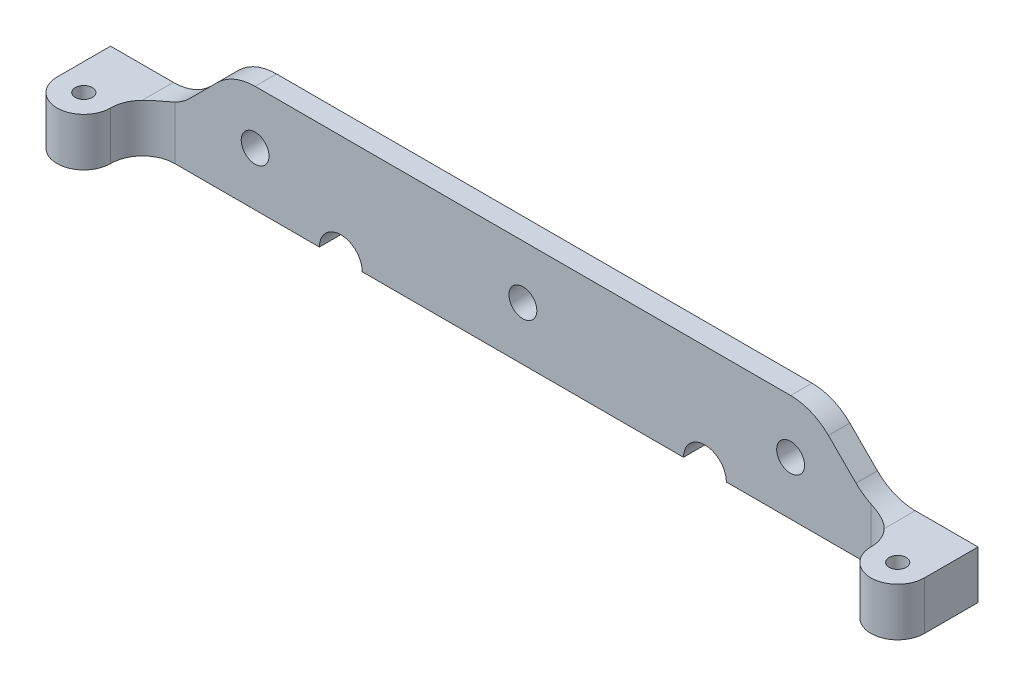
ISO-10303-21;
HEADER;
FILE_DESCRIPTION(('STEP AP214'),'2;1');
FILE_NAME('part.step','',(''),(''),'','','');
FILE_SCHEMA(('AUTOMOTIVE_DESIGN { 1 0 10303 214 1 1 1 1 }'));
ENDSEC;
DATA;
#1=APPLICATION_CONTEXT('core data for automotive mechanical design processes');
#2=APPLICATION_PROTOCOL_DEFINITION('international standard','automotive_design',2000,#1);
#3=PRODUCT_CONTEXT('',#1,'mechanical');
#4=PRODUCT('Part','Part','',(#3));
#5=PRODUCT_RELATED_PRODUCT_CATEGORY('part','',(#4));
#6=PRODUCT_DEFINITION_FORMATION('','',#4);
#7=PRODUCT_DEFINITION_CONTEXT('part definition',#1,'design');
#8=PRODUCT_DEFINITION('design','',#6,#7);
#9=PRODUCT_DEFINITION_SHAPE('','',#8);
#10=(LENGTH_UNIT() NAMED_UNIT(*) SI_UNIT(.MILLI.,.METRE.));
#11=(NAMED_UNIT(*) PLANE_ANGLE_UNIT() SI_UNIT($,.RADIAN.));
#12=(NAMED_UNIT(*) SI_UNIT($,.STERADIAN.) SOLID_ANGLE_UNIT());
#13=UNCERTAINTY_MEASURE_WITH_UNIT(LENGTH_MEASURE(1.E-05),#10,'distance_accuracy_value','');
#14=(GEOMETRIC_REPRESENTATION_CONTEXT(3) GLOBAL_UNCERTAINTY_ASSIGNED_CONTEXT((#13)) GLOBAL_UNIT_ASSIGNED_CONTEXT((#10,
#11,#12)) REPRESENTATION_CONTEXT('',''));
#15=CARTESIAN_POINT('',(0.,0.,0.));
#16=DIRECTION('',(0.,0.,1.));
#17=DIRECTION('',(1.,0.,0.));
#18=AXIS2_PLACEMENT_3D('',#15,#16,#17);
#19=CARTESIAN_POINT('',(84.,10.,14.9999999999999));
#20=DIRECTION('',(0.,0.,-1.));
#21=DIRECTION('',(-1.,0.,0.));
#22=AXIS2_PLACEMENT_3D('',#19,#20,#21);
#23=CYLINDRICAL_SURFACE('',#22,2.59999999999999);
#24=CARTESIAN_POINT('',(84.,10.,0.));
#25=DIRECTION('',(0.,0.,1.));
#26=DIRECTION('',(1.,0.,0.));
#27=AXIS2_PLACEMENT_3D('',#24,#25,#26);
#28=CIRCLE('',#27,2.59999999999999);
#29=CARTESIAN_POINT('',(86.6,10.,0.));
#30=VERTEX_POINT('',#29);
#31=EDGE_CURVE('E349',#30,#30,#28,.T.);
#32=ORIENTED_EDGE('',*,*,#31,.F.);
#33=EDGE_LOOP('',(#32));
#34=FACE_BOUND('',#33,.T.);
#35=CARTESIAN_POINT('',(84.,10.,4.00000000000001));
#36=DIRECTION('',(0.,0.,-1.));
#37=DIRECTION('',(-1.,0.,0.));
#38=AXIS2_PLACEMENT_3D('',#35,#36,#37);
#39=CIRCLE('',#38,2.59999999999999);
#40=CARTESIAN_POINT('',(81.4,10.,4.00000000000001));
#41=VERTEX_POINT('',#40);
#42=EDGE_CURVE('E288',#41,#41,#39,.F.);
#43=ORIENTED_EDGE('',*,*,#42,.T.);
#44=EDGE_LOOP('',(#43));
#45=FACE_BOUND('',#44,.T.);
#46=ADVANCED_FACE('F41',(#34,#45),#23,.F.);
#47=CARTESIAN_POINT('',(134.,10.,14.9999999999999));
#48=DIRECTION('',(0.,0.,-1.));
#49=DIRECTION('',(-1.,0.,0.));
#50=AXIS2_PLACEMENT_3D('',#47,#48,#49);
#51=CYLINDRICAL_SURFACE('',#50,2.59999999999999);
#52=CARTESIAN_POINT('',(134.,10.,0.));
#53=DIRECTION('',(0.,0.,1.));
#54=DIRECTION('',(1.,0.,0.));
#55=AXIS2_PLACEMENT_3D('',#52,#53,#54);
#56=CIRCLE('',#55,2.59999999999999);
#57=CARTESIAN_POINT('',(136.6,10.,0.));
#58=VERTEX_POINT('',#57);
#59=EDGE_CURVE('E306',#58,#58,#56,.T.);
#60=ORIENTED_EDGE('',*,*,#59,.F.);
#61=EDGE_LOOP('',(#60));
#62=FACE_BOUND('',#61,.T.);
#63=CARTESIAN_POINT('',(134.,10.,4.00000000000001));
#64=DIRECTION('',(0.,0.,-1.));
#65=DIRECTION('',(-1.,0.,0.));
#66=AXIS2_PLACEMENT_3D('',#63,#64,#65);
#67=CIRCLE('',#66,2.59999999999999);
#68=CARTESIAN_POINT('',(131.4,10.,4.00000000000001));
#69=VERTEX_POINT('',#68);
#70=EDGE_CURVE('E45',#69,#69,#67,.F.);
#71=ORIENTED_EDGE('',*,*,#70,.T.);
#72=EDGE_LOOP('',(#71));
#73=FACE_BOUND('',#72,.T.);
#74=ADVANCED_FACE('F399',(#62,#73),#51,.F.);
#75=CARTESIAN_POINT('',(153.284271247462,19.,14.9999999999999));
#76=DIRECTION('',(0.,0.,-1.));
#77=DIRECTION('',(-1.,0.,0.));
#78=AXIS2_PLACEMENT_3D('',#75,#76,#77);
#79=CYLINDRICAL_SURFACE('',#78,9.99999999999999);
#80=CARTESIAN_POINT('',(153.284271247462,19.,4.00000000000001));
#81=DIRECTION('',(0.,0.,-1.));
#82=DIRECTION('',(-1.,0.,0.));
#83=AXIS2_PLACEMENT_3D('',#80,#81,#82);
#84=CIRCLE('',#83,9.99999999999999);
#85=CARTESIAN_POINT('',(149.,9.96423661895851,4.00000000000001));
#86=VERTEX_POINT('',#85);
#87=CARTESIAN_POINT('',(146.213203435597,11.9289321881345,4.00000000000001));
#88=VERTEX_POINT('',#87);
#89=EDGE_CURVE('E278',#86,#88,#84,.T.);
#90=ORIENTED_EDGE('',*,*,#89,.F.);
#91=CARTESIAN_POINT('',(149.,9.96423661895851,4.00000000000001));
#92=CARTESIAN_POINT('',(149.138749431393,9.8984192498265,3.99997887817415));
#93=CARTESIAN_POINT('',(149.279069410286,9.83583094505265,4.00481276516446));
#94=CARTESIAN_POINT('',(149.561871879785,9.71737585118658,4.02468942888996));
#95=CARTESIAN_POINT('',(149.704355256328,9.66151190423762,4.03973650465718));
#96=CARTESIAN_POINT('',(149.990138543817,9.5569158908009,4.08050378477663));
#97=CARTESIAN_POINT('',(150.133436603373,9.50817158800034,4.10620537855208));
#98=CARTESIAN_POINT('',(150.419874814451,9.41784101831467,4.16858243535644));
#99=CARTESIAN_POINT('',(150.563014990624,9.37625340544351,4.20525583131568));
#100=CARTESIAN_POINT('',(150.848388395152,9.30008450704279,4.28986141475606));
#101=CARTESIAN_POINT('',(150.990616949652,9.26552727325394,4.33783107967604));
#102=CARTESIAN_POINT('',(151.272381867108,9.20341301056058,4.44491252276017));
#103=CARTESIAN_POINT('',(151.411918217315,9.17585601479754,4.50402435367275));
#104=CARTESIAN_POINT('',(151.686966567449,9.12740630149706,4.633131913491));
#105=CARTESIAN_POINT('',(151.822480677891,9.10651003086457,4.7031218098621));
#106=CARTESIAN_POINT('',(152.088327034559,9.07086537447003,4.85358598034522));
#107=CARTESIAN_POINT('',(152.21866050533,9.05611552796919,4.93405775739416));
#108=CARTESIAN_POINT('',(152.514715473269,9.02821507448193,5.13296056767832));
#109=CARTESIAN_POINT('',(152.67810254045,9.01715780660251,5.25520835694019));
#110=CARTESIAN_POINT('',(152.913203202294,9.00657813696541,5.45057752977183));
#111=CARTESIAN_POINT('',(152.989888527963,9.00405249843688,5.51768157524464));
#112=CARTESIAN_POINT('',(153.139752027719,9.00076395419453,5.65571406979957));
#113=CARTESIAN_POINT('',(153.212930814348,9.0000007395037,5.72664184629775));
#114=CARTESIAN_POINT('',(153.284271247462,9.00000000000001,5.79940243796549));
#115=B_SPLINE_CURVE_WITH_KNOTS('',3,(#91,#92,#93,#94,#95,#96,#97,#98,#99,#100,#101,#102,#103,
#104,#105,#106,#107,#108,#109,#110,#111,#112,#113,#114),.UNSPECIFIED.,.F.,.F.,(4,2,2,2,2,2,2,2,
2,2,2,4),(0.,0.460640431024338,0.921474879521441,1.38150774347853,1.84145399251242,
2.30294824747264,2.7644446872603,3.22569453293953,3.68683469690517,4.29848869081263,
4.60416021975942,4.90977815623639),.UNSPECIFIED.);
#116=CARTESIAN_POINT('',(153.284271247462,9.00000000000001,5.79940243796548));
#117=VERTEX_POINT('',#116);
#118=EDGE_CURVE('E324',#86,#117,#115,.T.);
#119=ORIENTED_EDGE('',*,*,#118,.T.);
#120=DIRECTION('',(0.,0.,-1.));
#121=VECTOR('',#120,1.);
#122=CARTESIAN_POINT('',(153.284271247462,9.,14.9999999999999));
#123=LINE('',#122,#121);
#124=CARTESIAN_POINT('',(153.284271247462,9.00000000000001,0.));
#125=VERTEX_POINT('',#124);
#126=EDGE_CURVE('E330',#117,#125,#123,.T.);
#127=ORIENTED_EDGE('',*,*,#126,.T.);
#128=CARTESIAN_POINT('',(153.284271247462,19.,0.));
#129=DIRECTION('',(0.,0.,1.));
#130=DIRECTION('',(1.,0.,0.));
#131=AXIS2_PLACEMENT_3D('',#128,#129,#130);
#132=CIRCLE('',#131,9.99999999999999);
#133=CARTESIAN_POINT('',(146.213203435597,11.9289321881345,0.));
#134=VERTEX_POINT('',#133);
#135=EDGE_CURVE('E374',#125,#134,#132,.F.);
#136=ORIENTED_EDGE('',*,*,#135,.T.);
#137=DIRECTION('',(0.,0.,-1.));
#138=VECTOR('',#137,1.);
#139=CARTESIAN_POINT('',(146.213203435597,11.9289321881345,14.9999999999999));
#140=LINE('',#139,#138);
#141=EDGE_CURVE('E50',#88,#134,#140,.T.);
#142=ORIENTED_EDGE('',*,*,#141,.F.);
#143=EDGE_LOOP('',(#90,#119,#127,#136,#142));
#144=FACE_BOUND('',#143,.T.);
#145=ADVANCED_FACE('F362',(#144),#79,.F.);
#146=CARTESIAN_POINT('',(0.,8.99999999999995,14.9999999999999));
#147=DIRECTION('',(0.,-1.,0.));
#148=DIRECTION('',(1.,0.,0.));
#149=AXIS2_PLACEMENT_3D('',#146,#147,#148);
#150=PLANE('',#149);
#151=ORIENTED_EDGE('',*,*,#126,.F.);
#152=CARTESIAN_POINT('',(149.,8.99999999999999,10.));
#153=DIRECTION('',(0.,-1.,0.));
#154=DIRECTION('',(1.,0.,0.));
#155=AXIS2_PLACEMENT_3D('',#152,#153,#154);
#156=CIRCLE('',#155,6.);
#157=CARTESIAN_POINT('',(155.,9.,9.99999999999995));
#158=VERTEX_POINT('',#157);
#159=EDGE_CURVE('E321',#117,#158,#156,.T.);
#160=ORIENTED_EDGE('',*,*,#159,.T.);
#161=CARTESIAN_POINT('',(160.,9.,9.9999999999999));
#162=DIRECTION('',(0.,-1.,0.));
#163=DIRECTION('',(1.,0.,0.));
#164=AXIS2_PLACEMENT_3D('',#161,#162,#163);
#165=CIRCLE('',#164,5.00000000000002);
#166=CARTESIAN_POINT('',(165.,9.,9.9999999999999));
#167=VERTEX_POINT('',#166);
#168=EDGE_CURVE('E325',#167,#158,#165,.T.);
#169=ORIENTED_EDGE('',*,*,#168,.F.);
#170=DIRECTION('',(0.,0.,-1.));
#171=VECTOR('',#170,1.);
#172=CARTESIAN_POINT('',(165.,9.,14.9999999999999));
#173=LINE('',#172,#171);
#174=CARTESIAN_POINT('',(165.,9.,0.));
#175=VERTEX_POINT('',#174);
#176=EDGE_CURVE('E328',#167,#175,#173,.T.);
#177=ORIENTED_EDGE('',*,*,#176,.T.);
#178=DIRECTION('',(-1.,0.,0.));
#179=VECTOR('',#178,1.);
#180=CARTESIAN_POINT('',(0.,8.99999999999995,0.));
#181=LINE('',#180,#179);
#182=EDGE_CURVE('E372',#175,#125,#181,.T.);
#183=ORIENTED_EDGE('',*,*,#182,.T.);
#184=EDGE_LOOP('',(#151,#160,#169,#177,#183));
#185=FACE_BOUND('',#184,.T.);
#186=CARTESIAN_POINT('',(160.,9.,9.9999999999999));
#187=DIRECTION('',(0.,-1.,0.));
#188=DIRECTION('',(1.,0.,0.));
#189=AXIS2_PLACEMENT_3D('',#186,#187,#188);
#190=CIRCLE('',#189,1.59999999999999);
#191=CARTESIAN_POINT('',(161.6,9.,9.9999999999999));
#192=VERTEX_POINT('',#191);
#193=EDGE_CURVE('E376',#192,#192,#190,.T.);
#194=ORIENTED_EDGE('',*,*,#193,.T.);
#195=EDGE_LOOP('',(#194));
#196=FACE_BOUND('',#195,.T.);
#197=ADVANCED_FACE('F369',(#185,#196),#150,.F.);
#198=CARTESIAN_POINT('',(134.,10.,14.9999999999999));
#199=DIRECTION('',(0.,0.,-1.));
#200=DIRECTION('',(-1.,0.,0.));
#201=AXIS2_PLACEMENT_3D('',#198,#199,#200);
#202=CYLINDRICAL_SURFACE('',#201,10.);
#203=DIRECTION('',(0.,0.,-1.));
#204=VECTOR('',#203,1.);
#205=CARTESIAN_POINT('',(134.,20.,14.9999999999999));
#206=LINE('',#205,#204);
#207=CARTESIAN_POINT('',(134.,20.,4.00000000000001));
#208=VERTEX_POINT('',#207);
#209=CARTESIAN_POINT('',(134.,20.,0.));
#210=VERTEX_POINT('',#209);
#211=EDGE_CURVE('E303',#208,#210,#206,.T.);
#212=ORIENTED_EDGE('',*,*,#211,.F.);
#213=CARTESIAN_POINT('',(134.,10.,4.00000000000001));
#214=DIRECTION('',(0.,0.,-1.));
#215=DIRECTION('',(-1.,0.,0.));
#216=AXIS2_PLACEMENT_3D('',#213,#214,#215);
#217=CIRCLE('',#216,10.);
#218=CARTESIAN_POINT('',(141.071067811865,17.0710678118655,4.00000000000001));
#219=VERTEX_POINT('',#218);
#220=EDGE_CURVE('E284',#208,#219,#217,.T.);
#221=ORIENTED_EDGE('',*,*,#220,.T.);
#222=DIRECTION('',(0.,0.,-1.));
#223=VECTOR('',#222,1.);
#224=CARTESIAN_POINT('',(141.071067811865,17.0710678118655,14.9999999999999));
#225=LINE('',#224,#223);
#226=CARTESIAN_POINT('',(141.071067811865,17.0710678118655,0.));
#227=VERTEX_POINT('',#226);
#228=EDGE_CURVE('E11',#219,#227,#225,.T.);
#229=ORIENTED_EDGE('',*,*,#228,.T.);
#230=CARTESIAN_POINT('',(134.,10.,0.));
#231=DIRECTION('',(0.,0.,1.));
#232=DIRECTION('',(1.,0.,0.));
#233=AXIS2_PLACEMENT_3D('',#230,#231,#232);
#234=CIRCLE('',#233,10.);
#235=EDGE_CURVE('E300',#210,#227,#234,.F.);
#236=ORIENTED_EDGE('',*,*,#235,.F.);
#237=EDGE_LOOP('',(#212,#221,#229,#236));
#238=FACE_BOUND('',#237,.T.);
#239=ADVANCED_FACE('F402',(#238),#202,.T.);
#240=CARTESIAN_POINT('',(79.0710678118645,79.0710678118656,14.9999999999999));
#241=DIRECTION('',(0.707106781186542,0.707106781186552,0.));
#242=DIRECTION('',(-0.707106781186553,0.707106781186543,0.));
#243=AXIS2_PLACEMENT_3D('',#240,#241,#242);
#244=PLANE('',#243);
#245=ORIENTED_EDGE('',*,*,#228,.F.);
#246=DIRECTION('',(0.707106781186553,-0.707106781186543,0.));
#247=VECTOR('',#246,1.);
#248=CARTESIAN_POINT('',(69.0710678118645,89.0710678118655,4.00000000000001));
#249=LINE('',#248,#247);
#250=EDGE_CURVE('E281',#219,#88,#249,.T.);
#251=ORIENTED_EDGE('',*,*,#250,.T.);
#252=ORIENTED_EDGE('',*,*,#141,.T.);
#253=DIRECTION('',(0.707106781186553,-0.707106781186543,0.));
#254=VECTOR('',#253,1.);
#255=CARTESIAN_POINT('',(79.0710678118645,79.0710678118656,0.));
#256=LINE('',#255,#254);
#257=EDGE_CURVE('E336',#227,#134,#256,.T.);
#258=ORIENTED_EDGE('',*,*,#257,.F.);
#259=EDGE_LOOP('',(#245,#251,#252,#258));
#260=FACE_BOUND('',#259,.T.);
#261=ADVANCED_FACE('F410',(#260),#244,.T.);
#262=CARTESIAN_POINT('',(160.,20.,9.9999999999999));
#263=DIRECTION('',(0.,-1.,0.));
#264=DIRECTION('',(0.,0.,-1.));
#265=AXIS2_PLACEMENT_3D('',#262,#263,#264);
#266=CYLINDRICAL_SURFACE('',#265,5.00000000000002);
#267=DIRECTION('',(0.,-1.,0.));
#268=VECTOR('',#267,1.);
#269=CARTESIAN_POINT('',(165.,20.,9.9999999999999));
#270=LINE('',#269,#268);
#271=CARTESIAN_POINT('',(165.,0.,9.9999999999999));
#272=VERTEX_POINT('',#271);
#273=EDGE_CURVE('E317',#167,#272,#270,.T.);
#274=ORIENTED_EDGE('',*,*,#273,.F.);
#275=ORIENTED_EDGE('',*,*,#168,.T.);
#276=DIRECTION('',(0.,-1.,0.));
#277=VECTOR('',#276,1.);
#278=CARTESIAN_POINT('',(155.,20.,9.99999999999995));
#279=LINE('',#278,#277);
#280=CARTESIAN_POINT('',(155.,0.,9.99999999999995));
#281=VERTEX_POINT('',#280);
#282=EDGE_CURVE('E314',#158,#281,#279,.T.);
#283=ORIENTED_EDGE('',*,*,#282,.T.);
#284=CARTESIAN_POINT('',(160.,0.,9.9999999999999));
#285=DIRECTION('',(0.,1.,0.));
#286=DIRECTION('',(0.,0.,1.));
#287=AXIS2_PLACEMENT_3D('',#284,#285,#286);
#288=CIRCLE('',#287,5.00000000000002);
#289=EDGE_CURVE('E259',#281,#272,#288,.T.);
#290=ORIENTED_EDGE('',*,*,#289,.T.);
#291=EDGE_LOOP('',(#274,#275,#283,#290));
#292=FACE_BOUND('',#291,.T.);
#293=ADVANCED_FACE('F387',(#292),#266,.T.);
#294=CARTESIAN_POINT('',(160.,20.,9.9999999999999));
#295=DIRECTION('',(0.,-1.,0.));
#296=DIRECTION('',(0.,0.,-1.));
#297=AXIS2_PLACEMENT_3D('',#294,#295,#296);
#298=CYLINDRICAL_SURFACE('',#297,1.59999999999999);
#299=CARTESIAN_POINT('',(160.,0.,9.9999999999999));
#300=DIRECTION('',(0.,1.,0.));
#301=DIRECTION('',(0.,0.,1.));
#302=AXIS2_PLACEMENT_3D('',#299,#300,#301);
#303=CIRCLE('',#302,1.59999999999999);
#304=CARTESIAN_POINT('',(160.,0.,11.5999999999999));
#305=VERTEX_POINT('',#304);
#306=EDGE_CURVE('E312',#305,#305,#303,.T.);
#307=ORIENTED_EDGE('',*,*,#306,.F.);
#308=EDGE_LOOP('',(#307));
#309=FACE_BOUND('',#308,.T.);
#310=ORIENTED_EDGE('',*,*,#193,.F.);
#311=EDGE_LOOP('',(#310));
#312=FACE_BOUND('',#311,.T.);
#313=ADVANCED_FACE('F395',(#309,#312),#298,.F.);
#314=CARTESIAN_POINT('',(118.,0.,14.9999999999999));
#315=DIRECTION('',(0.,0.,-1.));
#316=DIRECTION('',(-1.,0.,0.));
#317=AXIS2_PLACEMENT_3D('',#314,#315,#316);
#318=CYLINDRICAL_SURFACE('',#317,4.);
#319=DIRECTION('',(0.,0.,-1.));
#320=VECTOR('',#319,1.);
#321=CARTESIAN_POINT('',(122.,0.,14.9999999999999));
#322=LINE('',#321,#320);
#323=CARTESIAN_POINT('',(122.,0.,4.00000000000001));
#324=VERTEX_POINT('',#323);
#325=CARTESIAN_POINT('',(122.,0.,0.));
#326=VERTEX_POINT('',#325);
#327=EDGE_CURVE('E305',#324,#326,#322,.T.);
#328=ORIENTED_EDGE('',*,*,#327,.F.);
#329=CARTESIAN_POINT('',(118.,0.,4.00000000000001));
#330=DIRECTION('',(0.,0.,-1.));
#331=DIRECTION('',(-1.,0.,0.));
#332=AXIS2_PLACEMENT_3D('',#329,#330,#331);
#333=CIRCLE('',#332,4.);
#334=CARTESIAN_POINT('',(114.,0.,4.00000000000001));
#335=VERTEX_POINT('',#334);
#336=EDGE_CURVE('E287',#324,#335,#333,.F.);
#337=ORIENTED_EDGE('',*,*,#336,.T.);
#338=DIRECTION('',(0.,0.,-1.));
#339=VECTOR('',#338,1.);
#340=CARTESIAN_POINT('',(114.,0.,14.9999999999999));
#341=LINE('',#340,#339);
#342=CARTESIAN_POINT('',(114.,0.,0.));
#343=VERTEX_POINT('',#342);
#344=EDGE_CURVE('E282',#335,#343,#341,.T.);
#345=ORIENTED_EDGE('',*,*,#344,.T.);
#346=CARTESIAN_POINT('',(118.,0.,0.));
#347=DIRECTION('',(0.,0.,1.));
#348=DIRECTION('',(1.,0.,0.));
#349=AXIS2_PLACEMENT_3D('',#346,#347,#348);
#350=CIRCLE('',#349,4.);
#351=EDGE_CURVE('E323',#326,#343,#350,.T.);
#352=ORIENTED_EDGE('',*,*,#351,.F.);
#353=EDGE_LOOP('',(#328,#337,#345,#352));
#354=FACE_BOUND('',#353,.T.);
#355=ADVANCED_FACE('F398',(#354),#318,.F.);
#356=CARTESIAN_POINT('',(0.,20.,4.00000000000001));
#357=DIRECTION('',(0.,0.,-1.));
#358=DIRECTION('',(-1.,0.,0.));
#359=AXIS2_PLACEMENT_3D('',#356,#357,#358);
#360=PLANE('',#359);
#361=CARTESIAN_POINT('',(50.,0.,4.00000000000001));
#362=DIRECTION('',(0.,0.,1.));
#363=DIRECTION('',(1.,0.,0.));
#364=AXIS2_PLACEMENT_3D('',#361,#362,#363);
#365=CIRCLE('',#364,4.);
#366=CARTESIAN_POINT('',(46.,0.,4.00000000000001));
#367=VERTEX_POINT('',#366);
#368=CARTESIAN_POINT('',(54.,0.,4.00000000000001));
#369=VERTEX_POINT('',#368);
#370=EDGE_CURVE('E217',#367,#369,#365,.F.);
#371=ORIENTED_EDGE('',*,*,#370,.T.);
#372=DIRECTION('',(1.,0.,0.));
#373=VECTOR('',#372,1.);
#374=CARTESIAN_POINT('',(0.,0.,4.00000000000001));
#375=LINE('',#374,#373);
#376=EDGE_CURVE('E258',#369,#335,#375,.T.);
#377=ORIENTED_EDGE('',*,*,#376,.T.);
#378=ORIENTED_EDGE('',*,*,#336,.F.);
#379=CARTESIAN_POINT('',(149.,0.,4.00000000000001));
#380=VERTEX_POINT('',#379);
#381=EDGE_CURVE('E254',#324,#380,#375,.T.);
#382=ORIENTED_EDGE('',*,*,#381,.T.);
#383=DIRECTION('',(0.,-1.,0.));
#384=VECTOR('',#383,1.);
#385=CARTESIAN_POINT('',(149.,20.,4.00000000000001));
#386=LINE('',#385,#384);
#387=EDGE_CURVE('E296',#86,#380,#386,.T.);
#388=ORIENTED_EDGE('',*,*,#387,.F.);
#389=ORIENTED_EDGE('',*,*,#89,.T.);
#390=ORIENTED_EDGE('',*,*,#250,.F.);
#391=ORIENTED_EDGE('',*,*,#220,.F.);
#392=DIRECTION('',(1.,0.,0.));
#393=VECTOR('',#392,1.);
#394=CARTESIAN_POINT('',(0.,20.,4.00000000000001));
#395=LINE('',#394,#393);
#396=CARTESIAN_POINT('',(34.,20.,4.00000000000001));
#397=VERTEX_POINT('',#396);
#398=EDGE_CURVE('E299',#397,#208,#395,.T.);
#399=ORIENTED_EDGE('',*,*,#398,.F.);
#400=CARTESIAN_POINT('',(34.,10.,4.00000000000001));
#401=DIRECTION('',(0.,0.,1.));
#402=DIRECTION('',(1.,0.,0.));
#403=AXIS2_PLACEMENT_3D('',#400,#401,#402);
#404=CIRCLE('',#403,10.);
#405=CARTESIAN_POINT('',(26.9289321881345,17.0710678118655,4.00000000000001));
#406=VERTEX_POINT('',#405);
#407=EDGE_CURVE('E252',#397,#406,#404,.T.);
#408=ORIENTED_EDGE('',*,*,#407,.T.);
#409=DIRECTION('',(-0.707106781186553,-0.707106781186543,0.));
#410=VECTOR('',#409,1.);
#411=CARTESIAN_POINT('',(98.9289321881355,89.0710678118655,4.00000000000001));
#412=LINE('',#411,#410);
#413=CARTESIAN_POINT('',(21.7867965644034,11.9289321881345,4.00000000000001));
#414=VERTEX_POINT('',#413);
#415=EDGE_CURVE('E253',#406,#414,#412,.T.);
#416=ORIENTED_EDGE('',*,*,#415,.T.);
#417=CARTESIAN_POINT('',(14.715728752538,19.,4.00000000000001));
#418=DIRECTION('',(0.,0.,1.));
#419=DIRECTION('',(1.,0.,0.));
#420=AXIS2_PLACEMENT_3D('',#417,#418,#419);
#421=CIRCLE('',#420,9.99999999999999);
#422=CARTESIAN_POINT('',(19.,9.96423661895851,4.00000000000001));
#423=VERTEX_POINT('',#422);
#424=EDGE_CURVE('E551',#423,#414,#421,.T.);
#425=ORIENTED_EDGE('',*,*,#424,.F.);
#426=DIRECTION('',(0.,-1.,0.));
#427=VECTOR('',#426,1.);
#428=CARTESIAN_POINT('',(19.,20.,4.00000000000001));
#429=LINE('',#428,#427);
#430=CARTESIAN_POINT('',(19.,0.,4.00000000000001));
#431=VERTEX_POINT('',#430);
#432=EDGE_CURVE('E207',#423,#431,#429,.T.);
#433=ORIENTED_EDGE('',*,*,#432,.T.);
#434=DIRECTION('',(-1.,0.,0.));
#435=VECTOR('',#434,1.);
#436=CARTESIAN_POINT('',(168.,0.,4.00000000000001));
#437=LINE('',#436,#435);
#438=EDGE_CURVE('E199',#367,#431,#437,.T.);
#439=ORIENTED_EDGE('',*,*,#438,.F.);
#440=EDGE_LOOP('',(#371,#377,#378,#382,#388,#389,#390,#391,#399,#408,#416,#425,#433,#439));
#441=FACE_BOUND('',#440,.T.);
#442=ORIENTED_EDGE('',*,*,#42,.F.);
#443=EDGE_LOOP('',(#442));
#444=FACE_BOUND('',#443,.T.);
#445=ORIENTED_EDGE('',*,*,#70,.F.);
#446=EDGE_LOOP('',(#445));
#447=FACE_BOUND('',#446,.T.);
#448=CARTESIAN_POINT('',(34.,10.,4.00000000000001));
#449=DIRECTION('',(0.,0.,1.));
#450=DIRECTION('',(1.,0.,0.));
#451=AXIS2_PLACEMENT_3D('',#448,#449,#450);
#452=CIRCLE('',#451,2.59999999999999);
#453=CARTESIAN_POINT('',(36.6,10.,4.00000000000001));
#454=VERTEX_POINT('',#453);
#455=EDGE_CURVE('E249',#454,#454,#452,.F.);
#456=ORIENTED_EDGE('',*,*,#455,.T.);
#457=EDGE_LOOP('',(#456));
#458=FACE_BOUND('',#457,.T.);
#459=ADVANCED_FACE('F43',(#441,#444,#447,#458),#360,.F.);
#460=CARTESIAN_POINT('',(149.,20.,10.));
#461=DIRECTION('',(0.,-1.,0.));
#462=DIRECTION('',(0.,0.,-1.));
#463=AXIS2_PLACEMENT_3D('',#460,#461,#462);
#464=CYLINDRICAL_SURFACE('',#463,6.);
#465=ORIENTED_EDGE('',*,*,#159,.F.);
#466=ORIENTED_EDGE('',*,*,#118,.F.);
#467=ORIENTED_EDGE('',*,*,#387,.T.);
#468=CARTESIAN_POINT('',(149.,0.,10.));
#469=DIRECTION('',(0.,1.,0.));
#470=DIRECTION('',(0.,0.,1.));
#471=AXIS2_PLACEMENT_3D('',#468,#469,#470);
#472=CIRCLE('',#471,6.);
#473=EDGE_CURVE('E58',#281,#380,#472,.T.);
#474=ORIENTED_EDGE('',*,*,#473,.F.);
#475=ORIENTED_EDGE('',*,*,#282,.F.);
#476=EDGE_LOOP('',(#465,#466,#467,#474,#475));
#477=FACE_BOUND('',#476,.T.);
#478=ADVANCED_FACE('F404',(#477),#464,.F.);
#479=CARTESIAN_POINT('',(0.,0.,0.));
#480=DIRECTION('',(0.,1.,0.));
#481=DIRECTION('',(0.,0.,1.));
#482=AXIS2_PLACEMENT_3D('',#479,#480,#481);
#483=PLANE('',#482);
#484=ORIENTED_EDGE('',*,*,#306,.T.);
#485=EDGE_LOOP('',(#484));
#486=FACE_BOUND('',#485,.T.);
#487=ORIENTED_EDGE('',*,*,#381,.F.);
#488=ORIENTED_EDGE('',*,*,#327,.T.);
#489=DIRECTION('',(-1.,0.,0.));
#490=VECTOR('',#489,1.);
#491=CARTESIAN_POINT('',(0.,0.,0.));
#492=LINE('',#491,#490);
#493=CARTESIAN_POINT('',(165.,0.,0.));
#494=VERTEX_POINT('',#493);
#495=EDGE_CURVE('E340',#494,#326,#492,.T.);
#496=ORIENTED_EDGE('',*,*,#495,.F.);
#497=DIRECTION('',(0.,0.,-1.));
#498=VECTOR('',#497,1.);
#499=CARTESIAN_POINT('',(165.,0.,-4.57966997657882E-13));
#500=LINE('',#499,#498);
#501=EDGE_CURVE('E313',#272,#494,#500,.T.);
#502=ORIENTED_EDGE('',*,*,#501,.F.);
#503=ORIENTED_EDGE('',*,*,#289,.F.);
#504=ORIENTED_EDGE('',*,*,#473,.T.);
#505=EDGE_LOOP('',(#487,#488,#496,#502,#503,#504));
#506=FACE_BOUND('',#505,.T.);
#507=ADVANCED_FACE('F390',(#486,#506),#483,.F.);
#508=ORIENTED_EDGE('',*,*,#344,.F.);
#509=ORIENTED_EDGE('',*,*,#376,.F.);
#510=DIRECTION('',(0.,0.,-1.));
#511=VECTOR('',#510,1.);
#512=CARTESIAN_POINT('',(54.,0.,14.9999999999999));
#513=LINE('',#512,#511);
#514=CARTESIAN_POINT('',(54.,0.,0.));
#515=VERTEX_POINT('',#514);
#516=EDGE_CURVE('E473',#369,#515,#513,.T.);
#517=ORIENTED_EDGE('',*,*,#516,.T.);
#518=EDGE_CURVE('E342',#343,#515,#492,.T.);
#519=ORIENTED_EDGE('',*,*,#518,.F.);
#520=EDGE_LOOP('',(#508,#509,#517,#519));
#521=FACE_BOUND('',#520,.T.);
#522=ADVANCED_FACE('F428',(#521),#483,.F.);
#523=CARTESIAN_POINT('',(0.,20.,0.));
#524=DIRECTION('',(0.,0.,1.));
#525=DIRECTION('',(1.,0.,0.));
#526=AXIS2_PLACEMENT_3D('',#523,#524,#525);
#527=PLANE('',#526);
#528=ORIENTED_EDGE('',*,*,#518,.T.);
#529=CARTESIAN_POINT('',(50.,0.,0.));
#530=DIRECTION('',(0.,0.,-1.));
#531=DIRECTION('',(-1.,0.,0.));
#532=AXIS2_PLACEMENT_3D('',#529,#530,#531);
#533=CIRCLE('',#532,4.);
#534=CARTESIAN_POINT('',(46.,0.,0.));
#535=VERTEX_POINT('',#534);
#536=EDGE_CURVE('E236',#535,#515,#533,.T.);
#537=ORIENTED_EDGE('',*,*,#536,.F.);
#538=DIRECTION('',(1.,0.,0.));
#539=VECTOR('',#538,1.);
#540=CARTESIAN_POINT('',(168.,0.,0.));
#541=LINE('',#540,#539);
#542=CARTESIAN_POINT('',(2.99999999999998,0.,0.));
#543=VERTEX_POINT('',#542);
#544=EDGE_CURVE('E191',#543,#535,#541,.T.);
#545=ORIENTED_EDGE('',*,*,#544,.F.);
#546=DIRECTION('',(0.,-1.,0.));
#547=VECTOR('',#546,1.);
#548=CARTESIAN_POINT('',(2.99999999999998,20.,0.));
#549=LINE('',#548,#547);
#550=CARTESIAN_POINT('',(2.99999999999998,9.,0.));
#551=VERTEX_POINT('',#550);
#552=EDGE_CURVE('E187',#551,#543,#549,.T.);
#553=ORIENTED_EDGE('',*,*,#552,.F.);
#554=DIRECTION('',(1.,0.,0.));
#555=VECTOR('',#554,1.);
#556=CARTESIAN_POINT('',(168.,8.99999999999995,0.));
#557=LINE('',#556,#555);
#558=CARTESIAN_POINT('',(14.715728752538,9.00000000000001,0.));
#559=VERTEX_POINT('',#558);
#560=EDGE_CURVE('E220',#551,#559,#557,.T.);
#561=ORIENTED_EDGE('',*,*,#560,.T.);
#562=CARTESIAN_POINT('',(14.715728752538,19.,0.));
#563=DIRECTION('',(0.,0.,-1.));
#564=DIRECTION('',(-1.,0.,0.));
#565=AXIS2_PLACEMENT_3D('',#562,#563,#564);
#566=CIRCLE('',#565,9.99999999999999);
#567=CARTESIAN_POINT('',(21.7867965644034,11.9289321881345,0.));
#568=VERTEX_POINT('',#567);
#569=EDGE_CURVE('E216',#559,#568,#566,.F.);
#570=ORIENTED_EDGE('',*,*,#569,.T.);
#571=DIRECTION('',(-0.707106781186553,-0.707106781186543,0.));
#572=VECTOR('',#571,1.);
#573=CARTESIAN_POINT('',(88.9289321881355,79.0710678118656,0.));
#574=LINE('',#573,#572);
#575=CARTESIAN_POINT('',(26.9289321881345,17.0710678118655,0.));
#576=VERTEX_POINT('',#575);
#577=EDGE_CURVE('E224',#576,#568,#574,.T.);
#578=ORIENTED_EDGE('',*,*,#577,.F.);
#579=CARTESIAN_POINT('',(34.,10.,0.));
#580=DIRECTION('',(0.,0.,-1.));
#581=DIRECTION('',(-1.,0.,0.));
#582=AXIS2_PLACEMENT_3D('',#579,#580,#581);
#583=CIRCLE('',#582,10.);
#584=CARTESIAN_POINT('',(34.,20.,0.));
#585=VERTEX_POINT('',#584);
#586=EDGE_CURVE('E227',#585,#576,#583,.F.);
#587=ORIENTED_EDGE('',*,*,#586,.F.);
#588=DIRECTION('',(-1.,0.,0.));
#589=VECTOR('',#588,1.);
#590=CARTESIAN_POINT('',(0.,20.,0.));
#591=LINE('',#590,#589);
#592=EDGE_CURVE('E338',#210,#585,#591,.T.);
#593=ORIENTED_EDGE('',*,*,#592,.F.);
#594=ORIENTED_EDGE('',*,*,#235,.T.);
#595=ORIENTED_EDGE('',*,*,#257,.T.);
#596=ORIENTED_EDGE('',*,*,#135,.F.);
#597=ORIENTED_EDGE('',*,*,#182,.F.);
#598=DIRECTION('',(0.,-1.,0.));
#599=VECTOR('',#598,1.);
#600=CARTESIAN_POINT('',(165.,20.,0.));
#601=LINE('',#600,#599);
#602=EDGE_CURVE('E66',#175,#494,#601,.T.);
#603=ORIENTED_EDGE('',*,*,#602,.T.);
#604=ORIENTED_EDGE('',*,*,#495,.T.);
#605=ORIENTED_EDGE('',*,*,#351,.T.);
#606=EDGE_LOOP('',(#528,#537,#545,#553,#561,#570,#578,#587,#593,#594,#595,#596,#597,#603,#604,#605));
#607=FACE_BOUND('',#606,.T.);
#608=ORIENTED_EDGE('',*,*,#59,.T.);
#609=EDGE_LOOP('',(#608));
#610=FACE_BOUND('',#609,.T.);
#611=ORIENTED_EDGE('',*,*,#31,.T.);
#612=EDGE_LOOP('',(#611));
#613=FACE_BOUND('',#612,.T.);
#614=CARTESIAN_POINT('',(34.,10.,0.));
#615=DIRECTION('',(0.,0.,-1.));
#616=DIRECTION('',(-1.,0.,0.));
#617=AXIS2_PLACEMENT_3D('',#614,#615,#616);
#618=CIRCLE('',#617,2.59999999999999);
#619=CARTESIAN_POINT('',(31.4,10.,0.));
#620=VERTEX_POINT('',#619);
#621=EDGE_CURVE('E226',#620,#620,#618,.T.);
#622=ORIENTED_EDGE('',*,*,#621,.F.);
#623=EDGE_LOOP('',(#622));
#624=FACE_BOUND('',#623,.T.);
#625=ADVANCED_FACE('F418',(#607,#610,#613,#624),#527,.F.);
#626=CARTESIAN_POINT('',(0.,20.,0.));
#627=DIRECTION('',(0.,1.,0.));
#628=DIRECTION('',(0.,0.,1.));
#629=AXIS2_PLACEMENT_3D('',#626,#627,#628);
#630=PLANE('',#629);
#631=ORIENTED_EDGE('',*,*,#398,.T.);
#632=ORIENTED_EDGE('',*,*,#211,.T.);
#633=ORIENTED_EDGE('',*,*,#592,.T.);
#634=DIRECTION('',(0.,0.,-1.));
#635=VECTOR('',#634,1.);
#636=CARTESIAN_POINT('',(34.,20.,14.9999999999999));
#637=LINE('',#636,#635);
#638=EDGE_CURVE('E241',#397,#585,#637,.T.);
#639=ORIENTED_EDGE('',*,*,#638,.F.);
#640=EDGE_LOOP('',(#631,#632,#633,#639));
#641=FACE_BOUND('',#640,.T.);
#642=ADVANCED_FACE('F416',(#641),#630,.T.);
#643=CARTESIAN_POINT('',(165.,20.,-4.57966997657882E-13));
#644=DIRECTION('',(-1.,0.,0.));
#645=DIRECTION('',(0.,0.,1.));
#646=AXIS2_PLACEMENT_3D('',#643,#644,#645);
#647=PLANE('',#646);
#648=ORIENTED_EDGE('',*,*,#176,.F.);
#649=ORIENTED_EDGE('',*,*,#273,.T.);
#650=ORIENTED_EDGE('',*,*,#501,.T.);
#651=ORIENTED_EDGE('',*,*,#602,.F.);
#652=EDGE_LOOP('',(#648,#649,#650,#651));
#653=FACE_BOUND('',#652,.T.);
#654=ADVANCED_FACE('F384',(#653),#647,.F.);
#655=CARTESIAN_POINT('',(34.,10.,14.9999999999999));
#656=DIRECTION('',(0.,0.,-1.));
#657=DIRECTION('',(1.,0.,0.));
#658=AXIS2_PLACEMENT_3D('',#655,#656,#657);
#659=CYLINDRICAL_SURFACE('',#658,2.59999999999999);
#660=ORIENTED_EDGE('',*,*,#621,.T.);
#661=EDGE_LOOP('',(#660));
#662=FACE_BOUND('',#661,.T.);
#663=ORIENTED_EDGE('',*,*,#455,.F.);
#664=EDGE_LOOP('',(#663));
#665=FACE_BOUND('',#664,.T.);
#666=ADVANCED_FACE('F426',(#662,#665),#659,.F.);
#667=CARTESIAN_POINT('',(14.715728752538,19.,14.9999999999999));
#668=DIRECTION('',(0.,0.,-1.));
#669=DIRECTION('',(1.,0.,0.));
#670=AXIS2_PLACEMENT_3D('',#667,#668,#669);
#671=CYLINDRICAL_SURFACE('',#670,9.99999999999999);
#672=ORIENTED_EDGE('',*,*,#424,.T.);
#673=DIRECTION('',(0.,0.,-1.));
#674=VECTOR('',#673,1.);
#675=CARTESIAN_POINT('',(21.7867965644034,11.9289321881345,14.9999999999999));
#676=LINE('',#675,#674);
#677=EDGE_CURVE('E537',#414,#568,#676,.T.);
#678=ORIENTED_EDGE('',*,*,#677,.T.);
#679=ORIENTED_EDGE('',*,*,#569,.F.);
#680=DIRECTION('',(0.,0.,-1.));
#681=VECTOR('',#680,1.);
#682=CARTESIAN_POINT('',(14.715728752538,9.,14.9999999999999));
#683=LINE('',#682,#681);
#684=CARTESIAN_POINT('',(14.715728752538,9.00000000000001,5.79940243796548));
#685=VERTEX_POINT('',#684);
#686=EDGE_CURVE('E552',#685,#559,#683,.T.);
#687=ORIENTED_EDGE('',*,*,#686,.F.);
#688=CARTESIAN_POINT('',(19.,9.96423661895851,4.00000000000001));
#689=CARTESIAN_POINT('',(18.8612505686065,9.89841924982649,3.99997887817415));
#690=CARTESIAN_POINT('',(18.7209305897137,9.83583094505265,4.00481276516446));
#691=CARTESIAN_POINT('',(18.4381281202151,9.71737585118658,4.02468942888996));
#692=CARTESIAN_POINT('',(18.2956447436724,9.66151190423762,4.03973650465717));
#693=CARTESIAN_POINT('',(18.0098614561827,9.5569158908009,4.08050378477663));
#694=CARTESIAN_POINT('',(17.8665633966267,9.50817158800034,4.10620537855208));
#695=CARTESIAN_POINT('',(17.5801251855487,9.41784101831466,4.16858243535644));
#696=CARTESIAN_POINT('',(17.4369850093756,9.37625340544351,4.20525583131568));
#697=CARTESIAN_POINT('',(17.1516116048482,9.30008450704279,4.28986141475606));
#698=CARTESIAN_POINT('',(17.0093830503479,9.26552727325394,4.33783107967604));
#699=CARTESIAN_POINT('',(16.7276181328917,9.20341301056058,4.44491252276018));
#700=CARTESIAN_POINT('',(16.5880817826844,9.17585601479753,4.50402435367277));
#701=CARTESIAN_POINT('',(16.3130334325506,9.12740630149706,4.63313191349103));
#702=CARTESIAN_POINT('',(16.1775193221089,9.10651003086457,4.70312180986212));
#703=CARTESIAN_POINT('',(15.9116729654413,9.07086537447003,4.85358598034523));
#704=CARTESIAN_POINT('',(15.78133949467,9.05611552796919,4.93405775739417));
#705=CARTESIAN_POINT('',(15.4852845267314,9.02821507448193,5.13296056767832));
#706=CARTESIAN_POINT('',(15.3218974595502,9.01715780660251,5.2552083569402));
#707=CARTESIAN_POINT('',(15.0867967977056,9.00657813696541,5.45057752977183));
#708=CARTESIAN_POINT('',(15.0101114720373,9.00405249843688,5.51768157524464));
#709=CARTESIAN_POINT('',(14.860247972281,9.00076395419453,5.65571406979956));
#710=CARTESIAN_POINT('',(14.787069185652,9.0000007395037,5.72664184629775));
#711=CARTESIAN_POINT('',(14.715728752538,9.00000000000001,5.79940243796549));
#712=B_SPLINE_CURVE_WITH_KNOTS('',3,(#688,#689,#690,#691,#692,#693,#694,#695,#696,#697,#698,
#699,#700,#701,#702,#703,#704,#705,#706,#707,#708,#709,#710,#711),.UNSPECIFIED.,.F.,.F.,(4,2,2,
2,2,2,2,2,2,2,2,4),(0.,0.460640431024339,0.921474879521455,1.38150774347854,1.84145399251242,
2.30294824747266,2.76444468726037,3.22569453293955,3.68683469690517,4.29848869081264,
4.60416021975942,4.90977815623639),.UNSPECIFIED.);
#713=EDGE_CURVE('E486',#423,#685,#712,.T.);
#714=ORIENTED_EDGE('',*,*,#713,.F.);
#715=EDGE_LOOP('',(#672,#678,#679,#687,#714));
#716=FACE_BOUND('',#715,.T.);
#717=ADVANCED_FACE('F503',(#716),#671,.F.);
#718=CARTESIAN_POINT('',(168.,8.99999999999995,14.9999999999999));
#719=DIRECTION('',(0.,-1.,0.));
#720=DIRECTION('',(-1.,0.,0.));
#721=AXIS2_PLACEMENT_3D('',#718,#719,#720);
#722=PLANE('',#721);
#723=ORIENTED_EDGE('',*,*,#686,.T.);
#724=ORIENTED_EDGE('',*,*,#560,.F.);
#725=DIRECTION('',(0.,0.,-1.));
#726=VECTOR('',#725,1.);
#727=CARTESIAN_POINT('',(2.99999999999998,9.,14.9999999999999));
#728=LINE('',#727,#726);
#729=CARTESIAN_POINT('',(2.99999999999995,9.,9.9999999999999));
#730=VERTEX_POINT('',#729);
#731=EDGE_CURVE('E222',#730,#551,#728,.T.);
#732=ORIENTED_EDGE('',*,*,#731,.F.);
#733=CARTESIAN_POINT('',(7.99999999999998,9.,9.9999999999999));
#734=DIRECTION('',(0.,1.,0.));
#735=DIRECTION('',(-1.,0.,0.));
#736=AXIS2_PLACEMENT_3D('',#733,#734,#735);
#737=CIRCLE('',#736,5.00000000000002);
#738=CARTESIAN_POINT('',(13.,9.,9.99999999999995));
#739=VERTEX_POINT('',#738);
#740=EDGE_CURVE('E203',#730,#739,#737,.T.);
#741=ORIENTED_EDGE('',*,*,#740,.T.);
#742=CARTESIAN_POINT('',(19.,8.99999999999999,10.));
#743=DIRECTION('',(0.,1.,0.));
#744=DIRECTION('',(-1.,0.,0.));
#745=AXIS2_PLACEMENT_3D('',#742,#743,#744);
#746=CIRCLE('',#745,6.);
#747=EDGE_CURVE('E490',#685,#739,#746,.T.);
#748=ORIENTED_EDGE('',*,*,#747,.F.);
#749=EDGE_LOOP('',(#723,#724,#732,#741,#748));
#750=FACE_BOUND('',#749,.T.);
#751=CARTESIAN_POINT('',(7.99999999999998,9.,9.9999999999999));
#752=DIRECTION('',(0.,1.,0.));
#753=DIRECTION('',(-1.,0.,0.));
#754=AXIS2_PLACEMENT_3D('',#751,#752,#753);
#755=CIRCLE('',#754,1.59999999999999);
#756=CARTESIAN_POINT('',(6.39999999999999,9.,9.9999999999999));
#757=VERTEX_POINT('',#756);
#758=EDGE_CURVE('E213',#757,#757,#755,.T.);
#759=ORIENTED_EDGE('',*,*,#758,.F.);
#760=EDGE_LOOP('',(#759));
#761=FACE_BOUND('',#760,.T.);
#762=ADVANCED_FACE('F515',(#750,#761),#722,.F.);
#763=CARTESIAN_POINT('',(34.,10.,14.9999999999999));
#764=DIRECTION('',(0.,0.,-1.));
#765=DIRECTION('',(1.,0.,0.));
#766=AXIS2_PLACEMENT_3D('',#763,#764,#765);
#767=CYLINDRICAL_SURFACE('',#766,10.);
#768=ORIENTED_EDGE('',*,*,#638,.T.);
#769=ORIENTED_EDGE('',*,*,#586,.T.);
#770=DIRECTION('',(0.,0.,-1.));
#771=VECTOR('',#770,1.);
#772=CARTESIAN_POINT('',(26.9289321881345,17.0710678118655,14.9999999999999));
#773=LINE('',#772,#771);
#774=EDGE_CURVE('E230',#406,#576,#773,.T.);
#775=ORIENTED_EDGE('',*,*,#774,.F.);
#776=ORIENTED_EDGE('',*,*,#407,.F.);
#777=EDGE_LOOP('',(#768,#769,#775,#776));
#778=FACE_BOUND('',#777,.T.);
#779=ADVANCED_FACE('F518',(#778),#767,.T.);
#780=CARTESIAN_POINT('',(88.9289321881355,79.0710678118656,14.9999999999999));
#781=DIRECTION('',(-0.707106781186542,0.707106781186552,0.));
#782=DIRECTION('',(0.707106781186553,0.707106781186543,0.));
#783=AXIS2_PLACEMENT_3D('',#780,#781,#782);
#784=PLANE('',#783);
#785=ORIENTED_EDGE('',*,*,#774,.T.);
#786=ORIENTED_EDGE('',*,*,#577,.T.);
#787=ORIENTED_EDGE('',*,*,#677,.F.);
#788=ORIENTED_EDGE('',*,*,#415,.F.);
#789=EDGE_LOOP('',(#785,#786,#787,#788));
#790=FACE_BOUND('',#789,.T.);
#791=ADVANCED_FACE('F522',(#790),#784,.T.);
#792=CARTESIAN_POINT('',(7.99999999999998,20.,9.9999999999999));
#793=DIRECTION('',(0.,-1.,0.));
#794=DIRECTION('',(0.,0.,-1.));
#795=AXIS2_PLACEMENT_3D('',#792,#793,#794);
#796=CYLINDRICAL_SURFACE('',#795,5.00000000000002);
#797=DIRECTION('',(0.,-1.,0.));
#798=VECTOR('',#797,1.);
#799=CARTESIAN_POINT('',(2.99999999999995,20.,9.9999999999999));
#800=LINE('',#799,#798);
#801=CARTESIAN_POINT('',(2.99999999999995,0.,9.9999999999999));
#802=VERTEX_POINT('',#801);
#803=EDGE_CURVE('E185',#730,#802,#800,.T.);
#804=ORIENTED_EDGE('',*,*,#803,.T.);
#805=CARTESIAN_POINT('',(7.99999999999998,0.,9.9999999999999));
#806=DIRECTION('',(0.,-1.,0.));
#807=DIRECTION('',(0.,0.,1.));
#808=AXIS2_PLACEMENT_3D('',#805,#806,#807);
#809=CIRCLE('',#808,5.00000000000002);
#810=CARTESIAN_POINT('',(13.,0.,9.99999999999995));
#811=VERTEX_POINT('',#810);
#812=EDGE_CURVE('E194',#811,#802,#809,.T.);
#813=ORIENTED_EDGE('',*,*,#812,.F.);
#814=DIRECTION('',(0.,-1.,0.));
#815=VECTOR('',#814,1.);
#816=CARTESIAN_POINT('',(13.,20.,9.99999999999995));
#817=LINE('',#816,#815);
#818=EDGE_CURVE('E205',#739,#811,#817,.T.);
#819=ORIENTED_EDGE('',*,*,#818,.F.);
#820=ORIENTED_EDGE('',*,*,#740,.F.);
#821=EDGE_LOOP('',(#804,#813,#819,#820));
#822=FACE_BOUND('',#821,.T.);
#823=ADVANCED_FACE('F201',(#822),#796,.T.);
#824=CARTESIAN_POINT('',(7.99999999999998,20.,9.9999999999999));
#825=DIRECTION('',(0.,-1.,0.));
#826=DIRECTION('',(0.,0.,-1.));
#827=AXIS2_PLACEMENT_3D('',#824,#825,#826);
#828=CYLINDRICAL_SURFACE('',#827,1.59999999999999);
#829=CARTESIAN_POINT('',(7.99999999999998,0.,9.9999999999999));
#830=DIRECTION('',(0.,-1.,0.));
#831=DIRECTION('',(0.,0.,1.));
#832=AXIS2_PLACEMENT_3D('',#829,#830,#831);
#833=CIRCLE('',#832,1.59999999999999);
#834=CARTESIAN_POINT('',(7.99999999999998,0.,11.5999999999999));
#835=VERTEX_POINT('',#834);
#836=EDGE_CURVE('E553',#835,#835,#833,.T.);
#837=ORIENTED_EDGE('',*,*,#836,.T.);
#838=EDGE_LOOP('',(#837));
#839=FACE_BOUND('',#838,.T.);
#840=ORIENTED_EDGE('',*,*,#758,.T.);
#841=EDGE_LOOP('',(#840));
#842=FACE_BOUND('',#841,.T.);
#843=ADVANCED_FACE('F525',(#839,#842),#828,.F.);
#844=CARTESIAN_POINT('',(50.,0.,14.9999999999999));
#845=DIRECTION('',(0.,0.,-1.));
#846=DIRECTION('',(1.,0.,0.));
#847=AXIS2_PLACEMENT_3D('',#844,#845,#846);
#848=CYLINDRICAL_SURFACE('',#847,4.);
#849=DIRECTION('',(0.,0.,-1.));
#850=VECTOR('',#849,1.);
#851=CARTESIAN_POINT('',(46.,0.,14.9999999999999));
#852=LINE('',#851,#850);
#853=EDGE_CURVE('E209',#367,#535,#852,.T.);
#854=ORIENTED_EDGE('',*,*,#853,.T.);
#855=ORIENTED_EDGE('',*,*,#536,.T.);
#856=ORIENTED_EDGE('',*,*,#516,.F.);
#857=ORIENTED_EDGE('',*,*,#370,.F.);
#858=EDGE_LOOP('',(#854,#855,#856,#857));
#859=FACE_BOUND('',#858,.T.);
#860=ADVANCED_FACE('F512',(#859),#848,.F.);
#861=CARTESIAN_POINT('',(19.,20.,10.));
#862=DIRECTION('',(0.,-1.,0.));
#863=DIRECTION('',(0.,0.,-1.));
#864=AXIS2_PLACEMENT_3D('',#861,#862,#863);
#865=CYLINDRICAL_SURFACE('',#864,6.);
#866=ORIENTED_EDGE('',*,*,#747,.T.);
#867=ORIENTED_EDGE('',*,*,#818,.T.);
#868=CARTESIAN_POINT('',(19.,0.,10.));
#869=DIRECTION('',(0.,-1.,0.));
#870=DIRECTION('',(0.,0.,1.));
#871=AXIS2_PLACEMENT_3D('',#868,#869,#870);
#872=CIRCLE('',#871,6.);
#873=EDGE_CURVE('E190',#811,#431,#872,.T.);
#874=ORIENTED_EDGE('',*,*,#873,.T.);
#875=ORIENTED_EDGE('',*,*,#432,.F.);
#876=ORIENTED_EDGE('',*,*,#713,.T.);
#877=EDGE_LOOP('',(#866,#867,#874,#875,#876));
#878=FACE_BOUND('',#877,.T.);
#879=ADVANCED_FACE('F507',(#878),#865,.F.);
#880=CARTESIAN_POINT('',(168.,0.,0.));
#881=DIRECTION('',(0.,1.,0.));
#882=DIRECTION('',(0.,0.,1.));
#883=AXIS2_PLACEMENT_3D('',#880,#881,#882);
#884=PLANE('',#883);
#885=ORIENTED_EDGE('',*,*,#836,.F.);
#886=EDGE_LOOP('',(#885));
#887=FACE_BOUND('',#886,.T.);
#888=ORIENTED_EDGE('',*,*,#438,.T.);
#889=ORIENTED_EDGE('',*,*,#873,.F.);
#890=ORIENTED_EDGE('',*,*,#812,.T.);
#891=DIRECTION('',(0.,0.,-1.));
#892=VECTOR('',#891,1.);
#893=CARTESIAN_POINT('',(2.99999999999998,0.,-4.57966997657882E-13));
#894=LINE('',#893,#892);
#895=EDGE_CURVE('E180',#802,#543,#894,.T.);
#896=ORIENTED_EDGE('',*,*,#895,.T.);
#897=ORIENTED_EDGE('',*,*,#544,.T.);
#898=ORIENTED_EDGE('',*,*,#853,.F.);
#899=EDGE_LOOP('',(#888,#889,#890,#896,#897,#898));
#900=FACE_BOUND('',#899,.T.);
#901=ADVANCED_FACE('F196',(#887,#900),#884,.F.);
#902=CARTESIAN_POINT('',(2.99999999999998,20.,-4.57966997657882E-13));
#903=DIRECTION('',(1.,0.,0.));
#904=DIRECTION('',(0.,0.,1.));
#905=AXIS2_PLACEMENT_3D('',#902,#903,#904);
#906=PLANE('',#905);
#907=ORIENTED_EDGE('',*,*,#731,.T.);
#908=ORIENTED_EDGE('',*,*,#552,.T.);
#909=ORIENTED_EDGE('',*,*,#895,.F.);
#910=ORIENTED_EDGE('',*,*,#803,.F.);
#911=EDGE_LOOP('',(#907,#908,#909,#910));
#912=FACE_BOUND('',#911,.T.);
#913=ADVANCED_FACE('F183',(#912),#906,.F.);
#914=CLOSED_SHELL('',(#46,#74,#145,#197,#239,#261,#293,#313,#355,#459,#478,#507,#522,#625,#642,
#654,#666,#717,#762,#779,#791,#823,#843,#860,#879,#901,#913));
#915=MANIFOLD_SOLID_BREP('B2',#914);
#916=ADVANCED_BREP_SHAPE_REPRESENTATION('',(#18,#915),#14);
#917=SHAPE_DEFINITION_REPRESENTATION(#9,#916);
ENDSEC;
END-ISO-10303-21;
